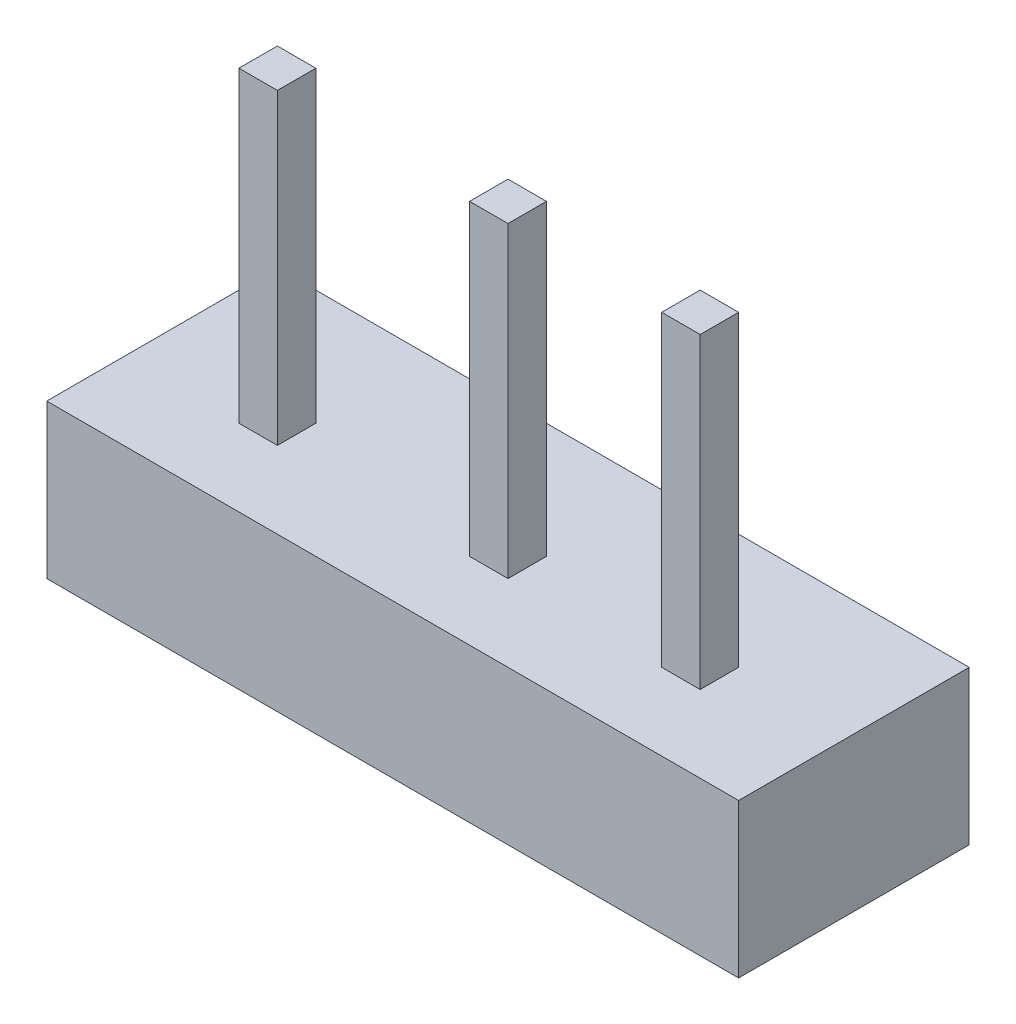
ISO-10303-21;
HEADER;
FILE_DESCRIPTION(('STEP AP214'),'2;1');
FILE_NAME('part.step','',(''),(''),'','','');
FILE_SCHEMA(('AUTOMOTIVE_DESIGN { 1 0 10303 214 1 1 1 1 }'));
ENDSEC;
DATA;
#1=APPLICATION_CONTEXT('core data for automotive mechanical design processes');
#2=APPLICATION_PROTOCOL_DEFINITION('international standard','automotive_design',2000,#1);
#3=PRODUCT_CONTEXT('',#1,'mechanical');
#4=PRODUCT('Part','Part','',(#3));
#5=PRODUCT_RELATED_PRODUCT_CATEGORY('part','',(#4));
#6=PRODUCT_DEFINITION_FORMATION('','',#4);
#7=PRODUCT_DEFINITION_CONTEXT('part definition',#1,'design');
#8=PRODUCT_DEFINITION('design','',#6,#7);
#9=PRODUCT_DEFINITION_SHAPE('','',#8);
#10=(LENGTH_UNIT() NAMED_UNIT(*) SI_UNIT(.MILLI.,.METRE.));
#11=(NAMED_UNIT(*) PLANE_ANGLE_UNIT() SI_UNIT($,.RADIAN.));
#12=(NAMED_UNIT(*) SI_UNIT($,.STERADIAN.) SOLID_ANGLE_UNIT());
#13=UNCERTAINTY_MEASURE_WITH_UNIT(LENGTH_MEASURE(1.E-05),#10,'distance_accuracy_value','');
#14=(GEOMETRIC_REPRESENTATION_CONTEXT(3) GLOBAL_UNCERTAINTY_ASSIGNED_CONTEXT((#13)) GLOBAL_UNIT_ASSIGNED_CONTEXT((#10,
#11,#12)) REPRESENTATION_CONTEXT('',''));
#15=CARTESIAN_POINT('',(0.,0.,0.));
#16=DIRECTION('',(0.,0.,1.));
#17=DIRECTION('',(1.,0.,0.));
#18=AXIS2_PLACEMENT_3D('',#15,#16,#17);
#19=CARTESIAN_POINT('',(0.,2.,0.));
#20=DIRECTION('',(1.,0.,0.));
#21=DIRECTION('',(0.,0.,-1.));
#22=AXIS2_PLACEMENT_3D('',#19,#20,#21);
#23=PLANE('',#22);
#24=DIRECTION('',(0.,0.,1.));
#25=VECTOR('',#24,1.);
#26=CARTESIAN_POINT('',(0.,0.,0.));
#27=LINE('',#26,#25);
#28=CARTESIAN_POINT('',(0.,0.,-3.));
#29=VERTEX_POINT('',#28);
#30=CARTESIAN_POINT('',(0.,0.,0.));
#31=VERTEX_POINT('',#30);
#32=EDGE_CURVE('E232',#29,#31,#27,.T.);
#33=ORIENTED_EDGE('',*,*,#32,.T.);
#34=DIRECTION('',(0.,-1.,0.));
#35=VECTOR('',#34,1.);
#36=CARTESIAN_POINT('',(0.,2.,0.));
#37=LINE('',#36,#35);
#38=CARTESIAN_POINT('',(0.,2.,0.));
#39=VERTEX_POINT('',#38);
#40=EDGE_CURVE('E11',#39,#31,#37,.T.);
#41=ORIENTED_EDGE('',*,*,#40,.F.);
#42=DIRECTION('',(0.,0.,1.));
#43=VECTOR('',#42,1.);
#44=CARTESIAN_POINT('',(0.,2.,0.));
#45=LINE('',#44,#43);
#46=CARTESIAN_POINT('',(0.,2.,-3.));
#47=VERTEX_POINT('',#46);
#48=EDGE_CURVE('E241',#47,#39,#45,.T.);
#49=ORIENTED_EDGE('',*,*,#48,.F.);
#50=DIRECTION('',(0.,-1.,0.));
#51=VECTOR('',#50,1.);
#52=CARTESIAN_POINT('',(0.,2.,-3.));
#53=LINE('',#52,#51);
#54=EDGE_CURVE('E251',#47,#29,#53,.T.);
#55=ORIENTED_EDGE('',*,*,#54,.T.);
#56=EDGE_LOOP('',(#33,#41,#49,#55));
#57=FACE_BOUND('',#56,.T.);
#58=ADVANCED_FACE('F34',(#57),#23,.F.);
#59=CARTESIAN_POINT('',(0.,2.,0.));
#60=DIRECTION('',(0.,0.,-1.));
#61=DIRECTION('',(-1.,0.,0.));
#62=AXIS2_PLACEMENT_3D('',#59,#60,#61);
#63=PLANE('',#62);
#64=DIRECTION('',(1.,0.,0.));
#65=VECTOR('',#64,1.);
#66=CARTESIAN_POINT('',(0.,0.,0.));
#67=LINE('',#66,#65);
#68=CARTESIAN_POINT('',(9.00000000000001,0.,0.));
#69=VERTEX_POINT('',#68);
#70=EDGE_CURVE('E254',#31,#69,#67,.T.);
#71=ORIENTED_EDGE('',*,*,#70,.T.);
#72=DIRECTION('',(0.,-1.,0.));
#73=VECTOR('',#72,1.);
#74=CARTESIAN_POINT('',(9.00000000000001,2.,0.));
#75=LINE('',#74,#73);
#76=CARTESIAN_POINT('',(9.00000000000001,2.,0.));
#77=VERTEX_POINT('',#76);
#78=EDGE_CURVE('E41',#77,#69,#75,.T.);
#79=ORIENTED_EDGE('',*,*,#78,.F.);
#80=DIRECTION('',(1.,0.,0.));
#81=VECTOR('',#80,1.);
#82=CARTESIAN_POINT('',(0.,2.,0.));
#83=LINE('',#82,#81);
#84=EDGE_CURVE('E244',#39,#77,#83,.T.);
#85=ORIENTED_EDGE('',*,*,#84,.F.);
#86=ORIENTED_EDGE('',*,*,#40,.T.);
#87=EDGE_LOOP('',(#71,#79,#85,#86));
#88=FACE_BOUND('',#87,.T.);
#89=ADVANCED_FACE('F283',(#88),#63,.F.);
#90=CARTESIAN_POINT('',(9.00000000000001,2.,0.));
#91=DIRECTION('',(-1.,0.,0.));
#92=DIRECTION('',(0.,0.,1.));
#93=AXIS2_PLACEMENT_3D('',#90,#91,#92);
#94=PLANE('',#93);
#95=DIRECTION('',(0.,0.,-1.));
#96=VECTOR('',#95,1.);
#97=CARTESIAN_POINT('',(9.00000000000001,0.,0.));
#98=LINE('',#97,#96);
#99=CARTESIAN_POINT('',(9.00000000000001,0.,-3.));
#100=VERTEX_POINT('',#99);
#101=EDGE_CURVE('E256',#69,#100,#98,.T.);
#102=ORIENTED_EDGE('',*,*,#101,.T.);
#103=DIRECTION('',(0.,-1.,0.));
#104=VECTOR('',#103,1.);
#105=CARTESIAN_POINT('',(9.00000000000001,2.,-3.));
#106=LINE('',#105,#104);
#107=CARTESIAN_POINT('',(9.00000000000001,2.,-3.));
#108=VERTEX_POINT('',#107);
#109=EDGE_CURVE('E261',#108,#100,#106,.T.);
#110=ORIENTED_EDGE('',*,*,#109,.F.);
#111=DIRECTION('',(0.,0.,-1.));
#112=VECTOR('',#111,1.);
#113=CARTESIAN_POINT('',(9.00000000000001,2.,0.));
#114=LINE('',#113,#112);
#115=EDGE_CURVE('E247',#77,#108,#114,.T.);
#116=ORIENTED_EDGE('',*,*,#115,.F.);
#117=ORIENTED_EDGE('',*,*,#78,.T.);
#118=EDGE_LOOP('',(#102,#110,#116,#117));
#119=FACE_BOUND('',#118,.T.);
#120=ADVANCED_FACE('F268',(#119),#94,.F.);
#121=CARTESIAN_POINT('',(0.,2.,-3.));
#122=DIRECTION('',(0.,0.,1.));
#123=DIRECTION('',(1.,0.,0.));
#124=AXIS2_PLACEMENT_3D('',#121,#122,#123);
#125=PLANE('',#124);
#126=DIRECTION('',(-1.,0.,0.));
#127=VECTOR('',#126,1.);
#128=CARTESIAN_POINT('',(0.,0.,-3.));
#129=LINE('',#128,#127);
#130=EDGE_CURVE('E245',#100,#29,#129,.T.);
#131=ORIENTED_EDGE('',*,*,#130,.T.);
#132=ORIENTED_EDGE('',*,*,#54,.F.);
#133=DIRECTION('',(-1.,0.,0.));
#134=VECTOR('',#133,1.);
#135=CARTESIAN_POINT('',(0.,2.,-3.));
#136=LINE('',#135,#134);
#137=EDGE_CURVE('E249',#108,#47,#136,.T.);
#138=ORIENTED_EDGE('',*,*,#137,.F.);
#139=ORIENTED_EDGE('',*,*,#109,.T.);
#140=EDGE_LOOP('',(#131,#132,#138,#139));
#141=FACE_BOUND('',#140,.T.);
#142=ADVANCED_FACE('F277',(#141),#125,.F.);
#143=CARTESIAN_POINT('',(0.,2.,0.));
#144=DIRECTION('',(0.,-1.,0.));
#145=DIRECTION('',(0.,0.,-1.));
#146=AXIS2_PLACEMENT_3D('',#143,#144,#145);
#147=PLANE('',#146);
#148=DIRECTION('',(0.,0.,1.));
#149=VECTOR('',#148,1.);
#150=CARTESIAN_POINT('',(7.50000000000001,2.,-1.5));
#151=LINE('',#150,#149);
#152=CARTESIAN_POINT('',(7.50000000000001,2.,-1.5));
#153=VERTEX_POINT('',#152);
#154=CARTESIAN_POINT('',(7.50000000000001,2.,-1.));
#155=VERTEX_POINT('',#154);
#156=EDGE_CURVE('E48',#153,#155,#151,.T.);
#157=ORIENTED_EDGE('',*,*,#156,.T.);
#158=DIRECTION('',(-1.,0.,0.));
#159=VECTOR('',#158,1.);
#160=CARTESIAN_POINT('',(7.50000000000001,2.,-1.));
#161=LINE('',#160,#159);
#162=CARTESIAN_POINT('',(7.00000000000001,2.,-1.));
#163=VERTEX_POINT('',#162);
#164=EDGE_CURVE('E143',#155,#163,#161,.T.);
#165=ORIENTED_EDGE('',*,*,#164,.T.);
#166=DIRECTION('',(0.,0.,1.));
#167=VECTOR('',#166,1.);
#168=CARTESIAN_POINT('',(7.00000000000001,2.,-1.5));
#169=LINE('',#168,#167);
#170=CARTESIAN_POINT('',(7.00000000000001,2.,-1.5));
#171=VERTEX_POINT('',#170);
#172=EDGE_CURVE('E148',#171,#163,#169,.T.);
#173=ORIENTED_EDGE('',*,*,#172,.F.);
#174=DIRECTION('',(-1.,0.,0.));
#175=VECTOR('',#174,1.);
#176=CARTESIAN_POINT('',(7.50000000000001,2.,-1.5));
#177=LINE('',#176,#175);
#178=EDGE_CURVE('E53',#153,#171,#177,.T.);
#179=ORIENTED_EDGE('',*,*,#178,.F.);
#180=EDGE_LOOP('',(#157,#165,#173,#179));
#181=FACE_BOUND('',#180,.T.);
#182=DIRECTION('',(0.,0.,1.));
#183=VECTOR('',#182,1.);
#184=CARTESIAN_POINT('',(5.,2.,-1.5));
#185=LINE('',#184,#183);
#186=CARTESIAN_POINT('',(5.,2.,-1.5));
#187=VERTEX_POINT('',#186);
#188=CARTESIAN_POINT('',(5.,2.,-1.));
#189=VERTEX_POINT('',#188);
#190=EDGE_CURVE('E189',#187,#189,#185,.T.);
#191=ORIENTED_EDGE('',*,*,#190,.T.);
#192=DIRECTION('',(-1.,0.,0.));
#193=VECTOR('',#192,1.);
#194=CARTESIAN_POINT('',(5.,2.,-1.));
#195=LINE('',#194,#193);
#196=CARTESIAN_POINT('',(4.5,2.,-1.));
#197=VERTEX_POINT('',#196);
#198=EDGE_CURVE('E198',#189,#197,#195,.T.);
#199=ORIENTED_EDGE('',*,*,#198,.T.);
#200=DIRECTION('',(0.,0.,1.));
#201=VECTOR('',#200,1.);
#202=CARTESIAN_POINT('',(4.5,2.,-1.5));
#203=LINE('',#202,#201);
#204=CARTESIAN_POINT('',(4.5,2.,-1.5));
#205=VERTEX_POINT('',#204);
#206=EDGE_CURVE('E195',#205,#197,#203,.T.);
#207=ORIENTED_EDGE('',*,*,#206,.F.);
#208=DIRECTION('',(-1.,0.,0.));
#209=VECTOR('',#208,1.);
#210=CARTESIAN_POINT('',(5.,2.,-1.5));
#211=LINE('',#210,#209);
#212=EDGE_CURVE('E191',#187,#205,#211,.T.);
#213=ORIENTED_EDGE('',*,*,#212,.F.);
#214=EDGE_LOOP('',(#191,#199,#207,#213));
#215=FACE_BOUND('',#214,.T.);
#216=DIRECTION('',(0.,0.,1.));
#217=VECTOR('',#216,1.);
#218=CARTESIAN_POINT('',(2.,2.,-1.5));
#219=LINE('',#218,#217);
#220=CARTESIAN_POINT('',(2.,2.,-1.5));
#221=VERTEX_POINT('',#220);
#222=CARTESIAN_POINT('',(2.,2.,-1.));
#223=VERTEX_POINT('',#222);
#224=EDGE_CURVE('E213',#221,#223,#219,.T.);
#225=ORIENTED_EDGE('',*,*,#224,.T.);
#226=DIRECTION('',(-1.,0.,0.));
#227=VECTOR('',#226,1.);
#228=CARTESIAN_POINT('',(2.,2.,-1.));
#229=LINE('',#228,#227);
#230=CARTESIAN_POINT('',(1.5,2.,-1.));
#231=VERTEX_POINT('',#230);
#232=EDGE_CURVE('E200',#223,#231,#229,.T.);
#233=ORIENTED_EDGE('',*,*,#232,.T.);
#234=DIRECTION('',(0.,0.,1.));
#235=VECTOR('',#234,1.);
#236=CARTESIAN_POINT('',(1.5,2.,-1.5));
#237=LINE('',#236,#235);
#238=CARTESIAN_POINT('',(1.5,2.,-1.5));
#239=VERTEX_POINT('',#238);
#240=EDGE_CURVE('E222',#239,#231,#237,.T.);
#241=ORIENTED_EDGE('',*,*,#240,.F.);
#242=DIRECTION('',(-1.,0.,0.));
#243=VECTOR('',#242,1.);
#244=CARTESIAN_POINT('',(2.,2.,-1.5));
#245=LINE('',#244,#243);
#246=EDGE_CURVE('E225',#221,#239,#245,.T.);
#247=ORIENTED_EDGE('',*,*,#246,.F.);
#248=EDGE_LOOP('',(#225,#233,#241,#247));
#249=FACE_BOUND('',#248,.T.);
#250=ORIENTED_EDGE('',*,*,#48,.T.);
#251=ORIENTED_EDGE('',*,*,#84,.T.);
#252=ORIENTED_EDGE('',*,*,#115,.T.);
#253=ORIENTED_EDGE('',*,*,#137,.T.);
#254=EDGE_LOOP('',(#250,#251,#252,#253));
#255=FACE_BOUND('',#254,.T.);
#256=ADVANCED_FACE('F145',(#181,#215,#249,#255),#147,.F.);
#257=CARTESIAN_POINT('',(0.,0.,0.));
#258=DIRECTION('',(0.,-1.,0.));
#259=DIRECTION('',(0.,0.,-1.));
#260=AXIS2_PLACEMENT_3D('',#257,#258,#259);
#261=PLANE('',#260);
#262=ORIENTED_EDGE('',*,*,#32,.F.);
#263=ORIENTED_EDGE('',*,*,#130,.F.);
#264=ORIENTED_EDGE('',*,*,#101,.F.);
#265=ORIENTED_EDGE('',*,*,#70,.F.);
#266=EDGE_LOOP('',(#262,#263,#264,#265));
#267=FACE_BOUND('',#266,.T.);
#268=ADVANCED_FACE('F274',(#267),#261,.T.);
#269=CARTESIAN_POINT('',(2.,6.00000000000001,-1.));
#270=DIRECTION('',(0.,0.,1.));
#271=DIRECTION('',(1.,0.,0.));
#272=AXIS2_PLACEMENT_3D('',#269,#270,#271);
#273=PLANE('',#272);
#274=ORIENTED_EDGE('',*,*,#232,.F.);
#275=DIRECTION('',(0.,-1.,0.));
#276=VECTOR('',#275,1.);
#277=CARTESIAN_POINT('',(2.,6.00000000000001,-1.));
#278=LINE('',#277,#276);
#279=CARTESIAN_POINT('',(2.,6.00000000000001,-1.));
#280=VERTEX_POINT('',#279);
#281=EDGE_CURVE('E229',#280,#223,#278,.T.);
#282=ORIENTED_EDGE('',*,*,#281,.F.);
#283=DIRECTION('',(-1.,0.,0.));
#284=VECTOR('',#283,1.);
#285=CARTESIAN_POINT('',(2.,6.00000000000001,-1.));
#286=LINE('',#285,#284);
#287=CARTESIAN_POINT('',(1.5,6.00000000000001,-1.));
#288=VERTEX_POINT('',#287);
#289=EDGE_CURVE('E209',#280,#288,#286,.T.);
#290=ORIENTED_EDGE('',*,*,#289,.T.);
#291=DIRECTION('',(0.,-1.,0.));
#292=VECTOR('',#291,1.);
#293=CARTESIAN_POINT('',(1.5,6.00000000000001,-1.));
#294=LINE('',#293,#292);
#295=EDGE_CURVE('E220',#288,#231,#294,.T.);
#296=ORIENTED_EDGE('',*,*,#295,.T.);
#297=EDGE_LOOP('',(#274,#282,#290,#296));
#298=FACE_BOUND('',#297,.T.);
#299=ADVANCED_FACE('F295',(#298),#273,.T.);
#300=CARTESIAN_POINT('',(2.,6.00000000000001,-1.5));
#301=DIRECTION('',(1.,0.,0.));
#302=DIRECTION('',(0.,0.,-1.));
#303=AXIS2_PLACEMENT_3D('',#300,#301,#302);
#304=PLANE('',#303);
#305=ORIENTED_EDGE('',*,*,#224,.F.);
#306=DIRECTION('',(0.,-1.,0.));
#307=VECTOR('',#306,1.);
#308=CARTESIAN_POINT('',(2.,6.00000000000001,-1.5));
#309=LINE('',#308,#307);
#310=CARTESIAN_POINT('',(2.,6.00000000000001,-1.5));
#311=VERTEX_POINT('',#310);
#312=EDGE_CURVE('E233',#311,#221,#309,.T.);
#313=ORIENTED_EDGE('',*,*,#312,.F.);
#314=DIRECTION('',(0.,0.,1.));
#315=VECTOR('',#314,1.);
#316=CARTESIAN_POINT('',(2.,6.00000000000001,-1.5));
#317=LINE('',#316,#315);
#318=EDGE_CURVE('E217',#311,#280,#317,.T.);
#319=ORIENTED_EDGE('',*,*,#318,.T.);
#320=ORIENTED_EDGE('',*,*,#281,.T.);
#321=EDGE_LOOP('',(#305,#313,#319,#320));
#322=FACE_BOUND('',#321,.T.);
#323=ADVANCED_FACE('F300',(#322),#304,.T.);
#324=CARTESIAN_POINT('',(2.,6.00000000000001,-1.5));
#325=DIRECTION('',(0.,0.,1.));
#326=DIRECTION('',(1.,0.,0.));
#327=AXIS2_PLACEMENT_3D('',#324,#325,#326);
#328=PLANE('',#327);
#329=ORIENTED_EDGE('',*,*,#246,.T.);
#330=DIRECTION('',(0.,-1.,0.));
#331=VECTOR('',#330,1.);
#332=CARTESIAN_POINT('',(1.5,6.00000000000001,-1.5));
#333=LINE('',#332,#331);
#334=CARTESIAN_POINT('',(1.5,6.00000000000001,-1.5));
#335=VERTEX_POINT('',#334);
#336=EDGE_CURVE('E236',#335,#239,#333,.T.);
#337=ORIENTED_EDGE('',*,*,#336,.F.);
#338=DIRECTION('',(-1.,0.,0.));
#339=VECTOR('',#338,1.);
#340=CARTESIAN_POINT('',(2.,6.00000000000001,-1.5));
#341=LINE('',#340,#339);
#342=EDGE_CURVE('E215',#311,#335,#341,.T.);
#343=ORIENTED_EDGE('',*,*,#342,.F.);
#344=ORIENTED_EDGE('',*,*,#312,.T.);
#345=EDGE_LOOP('',(#329,#337,#343,#344));
#346=FACE_BOUND('',#345,.T.);
#347=ADVANCED_FACE('F306',(#346),#328,.F.);
#348=CARTESIAN_POINT('',(1.5,6.00000000000001,-1.5));
#349=DIRECTION('',(1.,0.,0.));
#350=DIRECTION('',(0.,0.,-1.));
#351=AXIS2_PLACEMENT_3D('',#348,#349,#350);
#352=PLANE('',#351);
#353=ORIENTED_EDGE('',*,*,#240,.T.);
#354=ORIENTED_EDGE('',*,*,#295,.F.);
#355=DIRECTION('',(0.,0.,1.));
#356=VECTOR('',#355,1.);
#357=CARTESIAN_POINT('',(1.5,6.00000000000001,-1.5));
#358=LINE('',#357,#356);
#359=EDGE_CURVE('E212',#335,#288,#358,.T.);
#360=ORIENTED_EDGE('',*,*,#359,.F.);
#361=ORIENTED_EDGE('',*,*,#336,.T.);
#362=EDGE_LOOP('',(#353,#354,#360,#361));
#363=FACE_BOUND('',#362,.T.);
#364=ADVANCED_FACE('F302',(#363),#352,.F.);
#365=CARTESIAN_POINT('',(0.,6.00000000000001,0.));
#366=DIRECTION('',(0.,1.,0.));
#367=DIRECTION('',(0.,0.,1.));
#368=AXIS2_PLACEMENT_3D('',#365,#366,#367);
#369=PLANE('',#368);
#370=ORIENTED_EDGE('',*,*,#289,.F.);
#371=ORIENTED_EDGE('',*,*,#318,.F.);
#372=ORIENTED_EDGE('',*,*,#342,.T.);
#373=ORIENTED_EDGE('',*,*,#359,.T.);
#374=EDGE_LOOP('',(#370,#371,#372,#373));
#375=FACE_BOUND('',#374,.T.);
#376=ADVANCED_FACE('F305',(#375),#369,.T.);
#377=CARTESIAN_POINT('',(5.,6.00000000000001,-1.));
#378=DIRECTION('',(0.,0.,1.));
#379=DIRECTION('',(1.,0.,0.));
#380=AXIS2_PLACEMENT_3D('',#377,#378,#379);
#381=PLANE('',#380);
#382=ORIENTED_EDGE('',*,*,#198,.F.);
#383=DIRECTION('',(0.,-1.,0.));
#384=VECTOR('',#383,1.);
#385=CARTESIAN_POINT('',(5.,6.00000000000001,-1.));
#386=LINE('',#385,#384);
#387=CARTESIAN_POINT('',(5.,6.00000000000001,-1.));
#388=VERTEX_POINT('',#387);
#389=EDGE_CURVE('E150',#388,#189,#386,.T.);
#390=ORIENTED_EDGE('',*,*,#389,.F.);
#391=DIRECTION('',(-1.,0.,0.));
#392=VECTOR('',#391,1.);
#393=CARTESIAN_POINT('',(5.,6.00000000000001,-1.));
#394=LINE('',#393,#392);
#395=CARTESIAN_POINT('',(4.5,6.00000000000001,-1.));
#396=VERTEX_POINT('',#395);
#397=EDGE_CURVE('E192',#388,#396,#394,.T.);
#398=ORIENTED_EDGE('',*,*,#397,.T.);
#399=DIRECTION('',(0.,-1.,0.));
#400=VECTOR('',#399,1.);
#401=CARTESIAN_POINT('',(4.5,6.00000000000001,-1.));
#402=LINE('',#401,#400);
#403=EDGE_CURVE('E177',#396,#197,#402,.T.);
#404=ORIENTED_EDGE('',*,*,#403,.T.);
#405=EDGE_LOOP('',(#382,#390,#398,#404));
#406=FACE_BOUND('',#405,.T.);
#407=ADVANCED_FACE('F316',(#406),#381,.T.);
#408=CARTESIAN_POINT('',(5.,6.00000000000001,-1.5));
#409=DIRECTION('',(1.,0.,0.));
#410=DIRECTION('',(0.,0.,-1.));
#411=AXIS2_PLACEMENT_3D('',#408,#409,#410);
#412=PLANE('',#411);
#413=ORIENTED_EDGE('',*,*,#190,.F.);
#414=DIRECTION('',(0.,-1.,0.));
#415=VECTOR('',#414,1.);
#416=CARTESIAN_POINT('',(5.,6.00000000000001,-1.5));
#417=LINE('',#416,#415);
#418=CARTESIAN_POINT('',(5.,6.00000000000001,-1.5));
#419=VERTEX_POINT('',#418);
#420=EDGE_CURVE('E184',#419,#187,#417,.T.);
#421=ORIENTED_EDGE('',*,*,#420,.F.);
#422=DIRECTION('',(0.,0.,1.));
#423=VECTOR('',#422,1.);
#424=CARTESIAN_POINT('',(5.,6.00000000000001,-1.5));
#425=LINE('',#424,#423);
#426=EDGE_CURVE('E180',#419,#388,#425,.T.);
#427=ORIENTED_EDGE('',*,*,#426,.T.);
#428=ORIENTED_EDGE('',*,*,#389,.T.);
#429=EDGE_LOOP('',(#413,#421,#427,#428));
#430=FACE_BOUND('',#429,.T.);
#431=ADVANCED_FACE('F323',(#430),#412,.T.);
#432=CARTESIAN_POINT('',(5.,6.00000000000001,-1.5));
#433=DIRECTION('',(0.,0.,1.));
#434=DIRECTION('',(1.,0.,0.));
#435=AXIS2_PLACEMENT_3D('',#432,#433,#434);
#436=PLANE('',#435);
#437=ORIENTED_EDGE('',*,*,#212,.T.);
#438=DIRECTION('',(0.,-1.,0.));
#439=VECTOR('',#438,1.);
#440=CARTESIAN_POINT('',(4.5,6.00000000000001,-1.5));
#441=LINE('',#440,#439);
#442=CARTESIAN_POINT('',(4.5,6.00000000000001,-1.5));
#443=VERTEX_POINT('',#442);
#444=EDGE_CURVE('E181',#443,#205,#441,.T.);
#445=ORIENTED_EDGE('',*,*,#444,.F.);
#446=DIRECTION('',(-1.,0.,0.));
#447=VECTOR('',#446,1.);
#448=CARTESIAN_POINT('',(5.,6.00000000000001,-1.5));
#449=LINE('',#448,#447);
#450=EDGE_CURVE('E203',#419,#443,#449,.T.);
#451=ORIENTED_EDGE('',*,*,#450,.F.);
#452=ORIENTED_EDGE('',*,*,#420,.T.);
#453=EDGE_LOOP('',(#437,#445,#451,#452));
#454=FACE_BOUND('',#453,.T.);
#455=ADVANCED_FACE('F326',(#454),#436,.F.);
#456=CARTESIAN_POINT('',(4.5,6.00000000000001,-1.5));
#457=DIRECTION('',(1.,0.,0.));
#458=DIRECTION('',(0.,0.,-1.));
#459=AXIS2_PLACEMENT_3D('',#456,#457,#458);
#460=PLANE('',#459);
#461=ORIENTED_EDGE('',*,*,#206,.T.);
#462=ORIENTED_EDGE('',*,*,#403,.F.);
#463=DIRECTION('',(0.,0.,1.));
#464=VECTOR('',#463,1.);
#465=CARTESIAN_POINT('',(4.5,6.00000000000001,-1.5));
#466=LINE('',#465,#464);
#467=EDGE_CURVE('E205',#443,#396,#466,.T.);
#468=ORIENTED_EDGE('',*,*,#467,.F.);
#469=ORIENTED_EDGE('',*,*,#444,.T.);
#470=EDGE_LOOP('',(#461,#462,#468,#469));
#471=FACE_BOUND('',#470,.T.);
#472=ADVANCED_FACE('F321',(#471),#460,.F.);
#473=CARTESIAN_POINT('',(0.,6.00000000000001,0.));
#474=DIRECTION('',(0.,1.,0.));
#475=DIRECTION('',(0.,0.,1.));
#476=AXIS2_PLACEMENT_3D('',#473,#474,#475);
#477=PLANE('',#476);
#478=ORIENTED_EDGE('',*,*,#397,.F.);
#479=ORIENTED_EDGE('',*,*,#426,.F.);
#480=ORIENTED_EDGE('',*,*,#450,.T.);
#481=ORIENTED_EDGE('',*,*,#467,.T.);
#482=EDGE_LOOP('',(#478,#479,#480,#481));
#483=FACE_BOUND('',#482,.T.);
#484=ADVANCED_FACE('F318',(#483),#477,.T.);
#485=CARTESIAN_POINT('',(7.50000000000001,6.00000000000001,-1.));
#486=DIRECTION('',(0.,0.,1.));
#487=DIRECTION('',(1.,0.,0.));
#488=AXIS2_PLACEMENT_3D('',#485,#486,#487);
#489=PLANE('',#488);
#490=ORIENTED_EDGE('',*,*,#164,.F.);
#491=DIRECTION('',(0.,-1.,0.));
#492=VECTOR('',#491,1.);
#493=CARTESIAN_POINT('',(7.50000000000001,6.00000000000001,-1.));
#494=LINE('',#493,#492);
#495=CARTESIAN_POINT('',(7.50000000000001,6.00000000000001,-1.));
#496=VERTEX_POINT('',#495);
#497=EDGE_CURVE('E437',#496,#155,#494,.T.);
#498=ORIENTED_EDGE('',*,*,#497,.F.);
#499=DIRECTION('',(-1.,0.,0.));
#500=VECTOR('',#499,1.);
#501=CARTESIAN_POINT('',(7.50000000000001,6.00000000000001,-1.));
#502=LINE('',#501,#500);
#503=CARTESIAN_POINT('',(7.00000000000001,6.00000000000001,-1.));
#504=VERTEX_POINT('',#503);
#505=EDGE_CURVE('E157',#496,#504,#502,.T.);
#506=ORIENTED_EDGE('',*,*,#505,.T.);
#507=DIRECTION('',(0.,-1.,0.));
#508=VECTOR('',#507,1.);
#509=CARTESIAN_POINT('',(7.00000000000001,6.00000000000001,-1.));
#510=LINE('',#509,#508);
#511=EDGE_CURVE('E154',#504,#163,#510,.T.);
#512=ORIENTED_EDGE('',*,*,#511,.T.);
#513=EDGE_LOOP('',(#490,#498,#506,#512));
#514=FACE_BOUND('',#513,.T.);
#515=ADVANCED_FACE('F155',(#514),#489,.T.);
#516=CARTESIAN_POINT('',(7.50000000000001,6.00000000000001,-1.5));
#517=DIRECTION('',(1.,0.,0.));
#518=DIRECTION('',(0.,0.,-1.));
#519=AXIS2_PLACEMENT_3D('',#516,#517,#518);
#520=PLANE('',#519);
#521=ORIENTED_EDGE('',*,*,#156,.F.);
#522=DIRECTION('',(0.,-1.,0.));
#523=VECTOR('',#522,1.);
#524=CARTESIAN_POINT('',(7.50000000000001,6.00000000000001,-1.5));
#525=LINE('',#524,#523);
#526=CARTESIAN_POINT('',(7.50000000000001,6.00000000000001,-1.5));
#527=VERTEX_POINT('',#526);
#528=EDGE_CURVE('E435',#527,#153,#525,.T.);
#529=ORIENTED_EDGE('',*,*,#528,.F.);
#530=DIRECTION('',(0.,0.,1.));
#531=VECTOR('',#530,1.);
#532=CARTESIAN_POINT('',(7.50000000000001,6.00000000000001,-1.5));
#533=LINE('',#532,#531);
#534=EDGE_CURVE('E160',#527,#496,#533,.T.);
#535=ORIENTED_EDGE('',*,*,#534,.T.);
#536=ORIENTED_EDGE('',*,*,#497,.T.);
#537=EDGE_LOOP('',(#521,#529,#535,#536));
#538=FACE_BOUND('',#537,.T.);
#539=ADVANCED_FACE('F341',(#538),#520,.T.);
#540=CARTESIAN_POINT('',(7.50000000000001,6.00000000000001,-1.5));
#541=DIRECTION('',(0.,0.,1.));
#542=DIRECTION('',(1.,0.,0.));
#543=AXIS2_PLACEMENT_3D('',#540,#541,#542);
#544=PLANE('',#543);
#545=ORIENTED_EDGE('',*,*,#178,.T.);
#546=DIRECTION('',(0.,-1.,0.));
#547=VECTOR('',#546,1.);
#548=CARTESIAN_POINT('',(7.00000000000001,6.00000000000001,-1.5));
#549=LINE('',#548,#547);
#550=CARTESIAN_POINT('',(7.00000000000001,6.00000000000001,-1.5));
#551=VERTEX_POINT('',#550);
#552=EDGE_CURVE('E161',#551,#171,#549,.T.);
#553=ORIENTED_EDGE('',*,*,#552,.F.);
#554=DIRECTION('',(-1.,0.,0.));
#555=VECTOR('',#554,1.);
#556=CARTESIAN_POINT('',(7.50000000000001,6.00000000000001,-1.5));
#557=LINE('',#556,#555);
#558=EDGE_CURVE('E172',#527,#551,#557,.T.);
#559=ORIENTED_EDGE('',*,*,#558,.F.);
#560=ORIENTED_EDGE('',*,*,#528,.T.);
#561=EDGE_LOOP('',(#545,#553,#559,#560));
#562=FACE_BOUND('',#561,.T.);
#563=ADVANCED_FACE('F344',(#562),#544,.F.);
#564=CARTESIAN_POINT('',(7.00000000000001,6.00000000000001,-1.5));
#565=DIRECTION('',(1.,0.,0.));
#566=DIRECTION('',(0.,0.,-1.));
#567=AXIS2_PLACEMENT_3D('',#564,#565,#566);
#568=PLANE('',#567);
#569=ORIENTED_EDGE('',*,*,#172,.T.);
#570=ORIENTED_EDGE('',*,*,#511,.F.);
#571=DIRECTION('',(0.,0.,1.));
#572=VECTOR('',#571,1.);
#573=CARTESIAN_POINT('',(7.00000000000001,6.00000000000001,-1.5));
#574=LINE('',#573,#572);
#575=EDGE_CURVE('E174',#551,#504,#574,.T.);
#576=ORIENTED_EDGE('',*,*,#575,.F.);
#577=ORIENTED_EDGE('',*,*,#552,.T.);
#578=EDGE_LOOP('',(#569,#570,#576,#577));
#579=FACE_BOUND('',#578,.T.);
#580=ADVANCED_FACE('F164',(#579),#568,.F.);
#581=CARTESIAN_POINT('',(0.,6.00000000000001,0.));
#582=DIRECTION('',(0.,1.,0.));
#583=DIRECTION('',(0.,0.,1.));
#584=AXIS2_PLACEMENT_3D('',#581,#582,#583);
#585=PLANE('',#584);
#586=ORIENTED_EDGE('',*,*,#505,.F.);
#587=ORIENTED_EDGE('',*,*,#534,.F.);
#588=ORIENTED_EDGE('',*,*,#558,.T.);
#589=ORIENTED_EDGE('',*,*,#575,.T.);
#590=EDGE_LOOP('',(#586,#587,#588,#589));
#591=FACE_BOUND('',#590,.T.);
#592=ADVANCED_FACE('F337',(#591),#585,.T.);
#593=CLOSED_SHELL('',(#58,#89,#120,#142,#256,#268,#299,#323,#347,#364,#376,#407,#431,#455,#472,
#484,#515,#539,#563,#580,#592));
#594=MANIFOLD_SOLID_BREP('B2',#593);
#595=ADVANCED_BREP_SHAPE_REPRESENTATION('',(#18,#594),#14);
#596=SHAPE_DEFINITION_REPRESENTATION(#9,#595);
ENDSEC;
END-ISO-10303-21;
